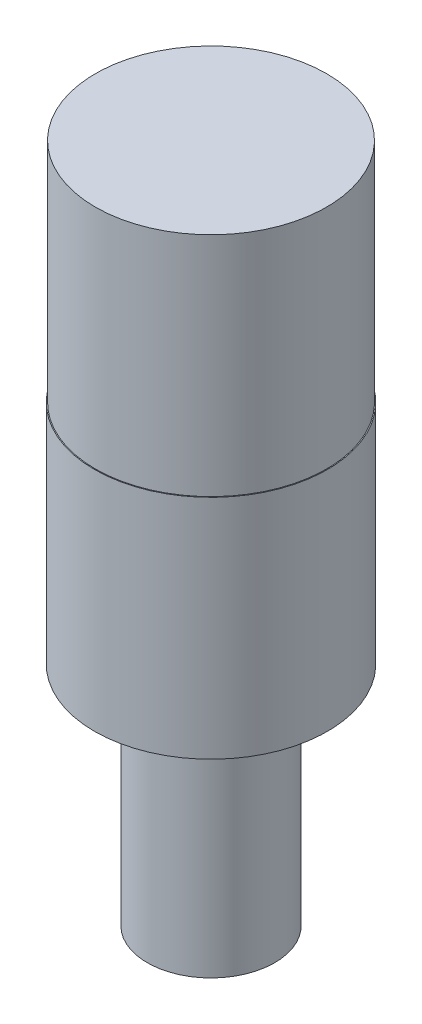
ISO-10303-21;
HEADER;
FILE_DESCRIPTION(('STEP AP214'),'2;1');
FILE_NAME('part.step','',(''),(''),'','','');
FILE_SCHEMA(('AUTOMOTIVE_DESIGN { 1 0 10303 214 1 1 1 1 }'));
ENDSEC;
DATA;
#1=APPLICATION_CONTEXT('core data for automotive mechanical design processes');
#2=APPLICATION_PROTOCOL_DEFINITION('international standard','automotive_design',2000,#1);
#3=PRODUCT_CONTEXT('',#1,'mechanical');
#4=PRODUCT('Part','Part','',(#3));
#5=PRODUCT_RELATED_PRODUCT_CATEGORY('part','',(#4));
#6=PRODUCT_DEFINITION_FORMATION('','',#4);
#7=PRODUCT_DEFINITION_CONTEXT('part definition',#1,'design');
#8=PRODUCT_DEFINITION('design','',#6,#7);
#9=PRODUCT_DEFINITION_SHAPE('','',#8);
#10=(LENGTH_UNIT() NAMED_UNIT(*) SI_UNIT(.MILLI.,.METRE.));
#11=(NAMED_UNIT(*) PLANE_ANGLE_UNIT() SI_UNIT($,.RADIAN.));
#12=(NAMED_UNIT(*) SI_UNIT($,.STERADIAN.) SOLID_ANGLE_UNIT());
#13=UNCERTAINTY_MEASURE_WITH_UNIT(LENGTH_MEASURE(1.E-05),#10,'distance_accuracy_value','');
#14=(GEOMETRIC_REPRESENTATION_CONTEXT(3) GLOBAL_UNCERTAINTY_ASSIGNED_CONTEXT((#13)) GLOBAL_UNIT_ASSIGNED_CONTEXT((#10,
#11,#12)) REPRESENTATION_CONTEXT('',''));
#15=CARTESIAN_POINT('',(0.,0.,0.));
#16=DIRECTION('',(0.,0.,1.));
#17=DIRECTION('',(1.,0.,0.));
#18=AXIS2_PLACEMENT_3D('',#15,#16,#17);
#19=CARTESIAN_POINT('',(0.,25.4,0.));
#20=DIRECTION('',(0.,1.,0.));
#21=DIRECTION('',(0.,0.,1.));
#22=AXIS2_PLACEMENT_3D('',#19,#20,#21);
#23=PLANE('',#22);
#24=CARTESIAN_POINT('',(0.,25.4,0.));
#25=DIRECTION('',(0.,1.,0.));
#26=DIRECTION('',(0.,0.,1.));
#27=AXIS2_PLACEMENT_3D('',#24,#25,#26);
#28=CIRCLE('',#27,6.475);
#29=CARTESIAN_POINT('',(0.,25.4,6.475));
#30=VERTEX_POINT('',#29);
#31=EDGE_CURVE('E10',#30,#30,#28,.T.);
#32=ORIENTED_EDGE('',*,*,#31,.F.);
#33=EDGE_LOOP('',(#32));
#34=FACE_BOUND('',#33,.T.);
#35=CARTESIAN_POINT('',(0.,25.4,0.));
#36=DIRECTION('',(0.,1.,0.));
#37=DIRECTION('',(0.,0.,1.));
#38=AXIS2_PLACEMENT_3D('',#35,#36,#37);
#39=CIRCLE('',#38,6.525);
#40=CARTESIAN_POINT('',(0.,25.4,6.525));
#41=VERTEX_POINT('',#40);
#42=EDGE_CURVE('E45',#41,#41,#39,.T.);
#43=ORIENTED_EDGE('',*,*,#42,.T.);
#44=EDGE_LOOP('',(#43));
#45=FACE_BOUND('',#44,.T.);
#46=ADVANCED_FACE('F34',(#34,#45),#23,.T.);
#47=CARTESIAN_POINT('',(0.,25.4,0.));
#48=DIRECTION('',(0.,1.,0.));
#49=DIRECTION('',(0.,0.,1.));
#50=AXIS2_PLACEMENT_3D('',#47,#48,#49);
#51=CYLINDRICAL_SURFACE('',#50,6.475);
#52=ORIENTED_EDGE('',*,*,#31,.T.);
#53=EDGE_LOOP('',(#52));
#54=FACE_BOUND('',#53,.T.);
#55=CARTESIAN_POINT('',(0.,38.1,0.));
#56=DIRECTION('',(0.,1.,0.));
#57=DIRECTION('',(0.,0.,1.));
#58=AXIS2_PLACEMENT_3D('',#55,#56,#57);
#59=CIRCLE('',#58,6.475);
#60=CARTESIAN_POINT('',(0.,38.1,6.475));
#61=VERTEX_POINT('',#60);
#62=EDGE_CURVE('E38',#61,#61,#59,.T.);
#63=ORIENTED_EDGE('',*,*,#62,.F.);
#64=EDGE_LOOP('',(#63));
#65=FACE_BOUND('',#64,.T.);
#66=ADVANCED_FACE('F77',(#54,#65),#51,.T.);
#67=CARTESIAN_POINT('',(0.,38.1,0.));
#68=DIRECTION('',(0.,1.,0.));
#69=DIRECTION('',(0.,0.,1.));
#70=AXIS2_PLACEMENT_3D('',#67,#68,#69);
#71=PLANE('',#70);
#72=ORIENTED_EDGE('',*,*,#62,.T.);
#73=EDGE_LOOP('',(#72));
#74=FACE_BOUND('',#73,.T.);
#75=ADVANCED_FACE('F72',(#74),#71,.T.);
#76=CARTESIAN_POINT('',(0.,12.7,0.));
#77=DIRECTION('',(0.,1.,0.));
#78=DIRECTION('',(0.,0.,1.));
#79=AXIS2_PLACEMENT_3D('',#76,#77,#78);
#80=CYLINDRICAL_SURFACE('',#79,6.525);
#81=CARTESIAN_POINT('',(0.,12.7,0.));
#82=DIRECTION('',(0.,-1.,0.));
#83=DIRECTION('',(0.,0.,-1.));
#84=AXIS2_PLACEMENT_3D('',#81,#82,#83);
#85=CIRCLE('',#84,6.525);
#86=CARTESIAN_POINT('',(0.,12.7,-6.525));
#87=VERTEX_POINT('',#86);
#88=EDGE_CURVE('E49',#87,#87,#85,.F.);
#89=ORIENTED_EDGE('',*,*,#88,.T.);
#90=EDGE_LOOP('',(#89));
#91=FACE_BOUND('',#90,.T.);
#92=ORIENTED_EDGE('',*,*,#42,.F.);
#93=EDGE_LOOP('',(#92));
#94=FACE_BOUND('',#93,.T.);
#95=ADVANCED_FACE('F64',(#91,#94),#80,.T.);
#96=CARTESIAN_POINT('',(0.,12.7,0.));
#97=DIRECTION('',(0.,-1.,0.));
#98=DIRECTION('',(0.,0.,-1.));
#99=AXIS2_PLACEMENT_3D('',#96,#97,#98);
#100=PLANE('',#99);
#101=ORIENTED_EDGE('',*,*,#88,.F.);
#102=EDGE_LOOP('',(#101));
#103=FACE_BOUND('',#102,.T.);
#104=CARTESIAN_POINT('',(0.,12.7,0.));
#105=DIRECTION('',(0.,-1.,0.));
#106=DIRECTION('',(0.,0.,-1.));
#107=AXIS2_PLACEMENT_3D('',#104,#105,#106);
#108=CIRCLE('',#107,3.5687);
#109=CARTESIAN_POINT('',(0.,12.7,-3.5687));
#110=VERTEX_POINT('',#109);
#111=EDGE_CURVE('E52',#110,#110,#108,.T.);
#112=ORIENTED_EDGE('',*,*,#111,.F.);
#113=EDGE_LOOP('',(#112));
#114=FACE_BOUND('',#113,.T.);
#115=ADVANCED_FACE('F62',(#103,#114),#100,.T.);
#116=CARTESIAN_POINT('',(0.,12.7,0.));
#117=DIRECTION('',(0.,-1.,0.));
#118=DIRECTION('',(0.,0.,-1.));
#119=AXIS2_PLACEMENT_3D('',#116,#117,#118);
#120=CYLINDRICAL_SURFACE('',#119,3.5687);
#121=ORIENTED_EDGE('',*,*,#111,.T.);
#122=EDGE_LOOP('',(#121));
#123=FACE_BOUND('',#122,.T.);
#124=CARTESIAN_POINT('',(0.,0.,0.));
#125=DIRECTION('',(0.,-1.,0.));
#126=DIRECTION('',(0.,0.,-1.));
#127=AXIS2_PLACEMENT_3D('',#124,#125,#126);
#128=CIRCLE('',#127,3.5687);
#129=CARTESIAN_POINT('',(0.,0.,-3.5687));
#130=VERTEX_POINT('',#129);
#131=EDGE_CURVE('E53',#130,#130,#128,.T.);
#132=ORIENTED_EDGE('',*,*,#131,.F.);
#133=EDGE_LOOP('',(#132));
#134=FACE_BOUND('',#133,.T.);
#135=ADVANCED_FACE('F59',(#123,#134),#120,.T.);
#136=CARTESIAN_POINT('',(0.,0.,0.));
#137=DIRECTION('',(0.,1.,0.));
#138=DIRECTION('',(0.,0.,1.));
#139=AXIS2_PLACEMENT_3D('',#136,#137,#138);
#140=PLANE('',#139);
#141=ORIENTED_EDGE('',*,*,#131,.T.);
#142=EDGE_LOOP('',(#141));
#143=FACE_BOUND('',#142,.T.);
#144=ADVANCED_FACE('F36',(#143),#140,.F.);
#145=CLOSED_SHELL('',(#46,#66,#75,#95,#115,#135,#144));
#146=MANIFOLD_SOLID_BREP('B2',#145);
#147=ADVANCED_BREP_SHAPE_REPRESENTATION('',(#18,#146),#14);
#148=SHAPE_DEFINITION_REPRESENTATION(#9,#147);
ENDSEC;
END-ISO-10303-21;
